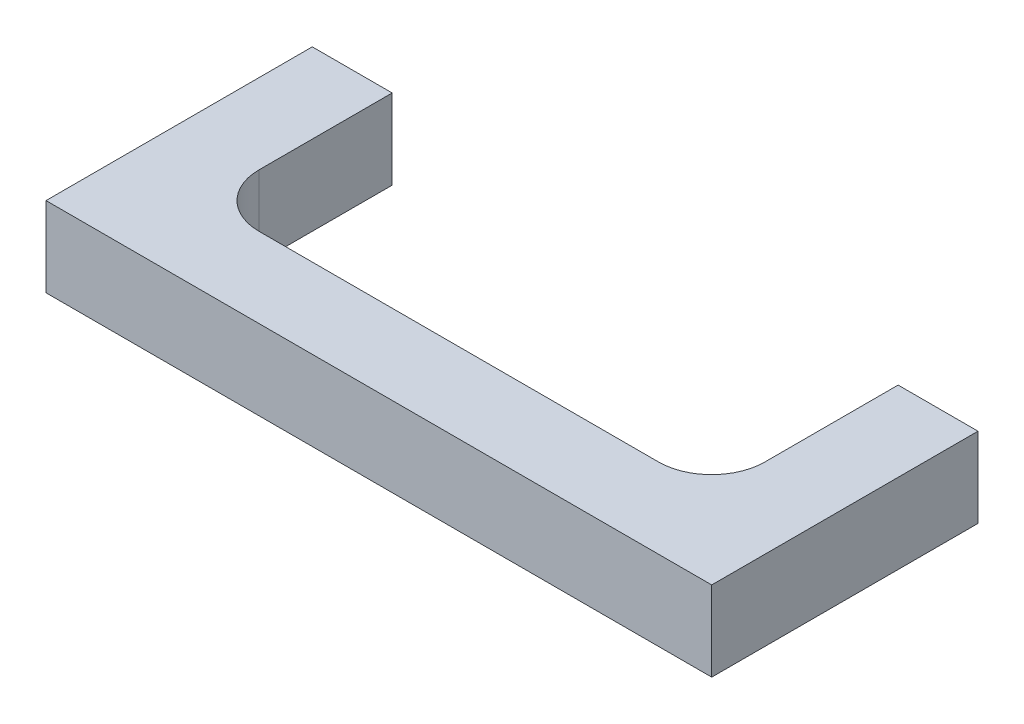
ISO-10303-21;
HEADER;
FILE_DESCRIPTION(('STEP AP214'),'2;1');
FILE_NAME('part.step','',(''),(''),'','','');
FILE_SCHEMA(('AUTOMOTIVE_DESIGN { 1 0 10303 214 1 1 1 1 }'));
ENDSEC;
DATA;
#1=APPLICATION_CONTEXT('core data for automotive mechanical design processes');
#2=APPLICATION_PROTOCOL_DEFINITION('international standard','automotive_design',2000,#1);
#3=PRODUCT_CONTEXT('',#1,'mechanical');
#4=PRODUCT('Part','Part','',(#3));
#5=PRODUCT_RELATED_PRODUCT_CATEGORY('part','',(#4));
#6=PRODUCT_DEFINITION_FORMATION('','',#4);
#7=PRODUCT_DEFINITION_CONTEXT('part definition',#1,'design');
#8=PRODUCT_DEFINITION('design','',#6,#7);
#9=PRODUCT_DEFINITION_SHAPE('','',#8);
#10=(LENGTH_UNIT() NAMED_UNIT(*) SI_UNIT(.MILLI.,.METRE.));
#11=(NAMED_UNIT(*) PLANE_ANGLE_UNIT() SI_UNIT($,.RADIAN.));
#12=(NAMED_UNIT(*) SI_UNIT($,.STERADIAN.) SOLID_ANGLE_UNIT());
#13=UNCERTAINTY_MEASURE_WITH_UNIT(LENGTH_MEASURE(1.E-05),#10,'distance_accuracy_value','');
#14=(GEOMETRIC_REPRESENTATION_CONTEXT(3) GLOBAL_UNCERTAINTY_ASSIGNED_CONTEXT((#13)) GLOBAL_UNIT_ASSIGNED_CONTEXT((#10,
#11,#12)) REPRESENTATION_CONTEXT('',''));
#15=CARTESIAN_POINT('',(0.,0.,0.));
#16=DIRECTION('',(0.,0.,1.));
#17=DIRECTION('',(1.,0.,0.));
#18=AXIS2_PLACEMENT_3D('',#15,#16,#17);
#19=CARTESIAN_POINT('',(-12.5,-3.,0.));
#20=DIRECTION('',(-1.,0.,0.));
#21=DIRECTION('',(0.,0.,1.));
#22=AXIS2_PLACEMENT_3D('',#19,#20,#21);
#23=PLANE('',#22);
#24=DIRECTION('',(0.,0.,1.));
#25=VECTOR('',#24,1.);
#26=CARTESIAN_POINT('',(-12.5,0.,0.));
#27=LINE('',#26,#25);
#28=CARTESIAN_POINT('',(-12.5,0.,-10.));
#29=VERTEX_POINT('',#28);
#30=CARTESIAN_POINT('',(-12.5,0.,0.));
#31=VERTEX_POINT('',#30);
#32=EDGE_CURVE('E151',#29,#31,#27,.T.);
#33=ORIENTED_EDGE('',*,*,#32,.F.);
#34=DIRECTION('',(0.,1.,0.));
#35=VECTOR('',#34,1.);
#36=CARTESIAN_POINT('',(-12.5,-3.,-10.));
#37=LINE('',#36,#35);
#38=CARTESIAN_POINT('',(-12.5,-3.,-10.));
#39=VERTEX_POINT('',#38);
#40=EDGE_CURVE('E132',#39,#29,#37,.T.);
#41=ORIENTED_EDGE('',*,*,#40,.F.);
#42=DIRECTION('',(0.,0.,1.));
#43=VECTOR('',#42,1.);
#44=CARTESIAN_POINT('',(-12.5,-3.,0.));
#45=LINE('',#44,#43);
#46=CARTESIAN_POINT('',(-12.5,-3.,0.));
#47=VERTEX_POINT('',#46);
#48=EDGE_CURVE('E126',#39,#47,#45,.T.);
#49=ORIENTED_EDGE('',*,*,#48,.T.);
#50=DIRECTION('',(0.,1.,0.));
#51=VECTOR('',#50,1.);
#52=CARTESIAN_POINT('',(-12.5,-3.,0.));
#53=LINE('',#52,#51);
#54=EDGE_CURVE('E108',#47,#31,#53,.T.);
#55=ORIENTED_EDGE('',*,*,#54,.T.);
#56=EDGE_LOOP('',(#33,#41,#49,#55));
#57=FACE_BOUND('',#56,.T.);
#58=ADVANCED_FACE('F33',(#57),#23,.T.);
#59=CARTESIAN_POINT('',(-12.5,-3.,-10.));
#60=DIRECTION('',(0.,0.,-1.));
#61=DIRECTION('',(-1.,0.,0.));
#62=AXIS2_PLACEMENT_3D('',#59,#60,#61);
#63=PLANE('',#62);
#64=DIRECTION('',(-1.,0.,0.));
#65=VECTOR('',#64,1.);
#66=CARTESIAN_POINT('',(-12.5,0.,-10.));
#67=LINE('',#66,#65);
#68=CARTESIAN_POINT('',(-9.5,0.,-10.));
#69=VERTEX_POINT('',#68);
#70=EDGE_CURVE('E133',#69,#29,#67,.T.);
#71=ORIENTED_EDGE('',*,*,#70,.F.);
#72=DIRECTION('',(0.,1.,0.));
#73=VECTOR('',#72,1.);
#74=CARTESIAN_POINT('',(-9.5,-3.,-10.));
#75=LINE('',#74,#73);
#76=CARTESIAN_POINT('',(-9.5,-3.,-10.));
#77=VERTEX_POINT('',#76);
#78=EDGE_CURVE('E167',#77,#69,#75,.T.);
#79=ORIENTED_EDGE('',*,*,#78,.F.);
#80=DIRECTION('',(-1.,0.,0.));
#81=VECTOR('',#80,1.);
#82=CARTESIAN_POINT('',(-12.5,-3.,-10.));
#83=LINE('',#82,#81);
#84=EDGE_CURVE('E119',#77,#39,#83,.T.);
#85=ORIENTED_EDGE('',*,*,#84,.T.);
#86=ORIENTED_EDGE('',*,*,#40,.T.);
#87=EDGE_LOOP('',(#71,#79,#85,#86));
#88=FACE_BOUND('',#87,.T.);
#89=ADVANCED_FACE('F206',(#88),#63,.T.);
#90=CARTESIAN_POINT('',(-9.5,-3.,-10.));
#91=DIRECTION('',(1.,0.,0.));
#92=DIRECTION('',(0.,0.,-1.));
#93=AXIS2_PLACEMENT_3D('',#90,#91,#92);
#94=PLANE('',#93);
#95=DIRECTION('',(0.,0.,-1.));
#96=VECTOR('',#95,1.);
#97=CARTESIAN_POINT('',(-9.5,0.,-10.));
#98=LINE('',#97,#96);
#99=CARTESIAN_POINT('',(-9.5,0.,-5.));
#100=VERTEX_POINT('',#99);
#101=EDGE_CURVE('E136',#100,#69,#98,.T.);
#102=ORIENTED_EDGE('',*,*,#101,.F.);
#103=DIRECTION('',(0.,1.,0.));
#104=VECTOR('',#103,1.);
#105=CARTESIAN_POINT('',(-9.5,-3.,-5.));
#106=LINE('',#105,#104);
#107=CARTESIAN_POINT('',(-9.5,-3.,-5.));
#108=VERTEX_POINT('',#107);
#109=EDGE_CURVE('E177',#100,#108,#106,.F.);
#110=ORIENTED_EDGE('',*,*,#109,.T.);
#111=DIRECTION('',(0.,0.,-1.));
#112=VECTOR('',#111,1.);
#113=CARTESIAN_POINT('',(-9.5,-3.,-10.));
#114=LINE('',#113,#112);
#115=EDGE_CURVE('E148',#108,#77,#114,.T.);
#116=ORIENTED_EDGE('',*,*,#115,.T.);
#117=ORIENTED_EDGE('',*,*,#78,.T.);
#118=EDGE_LOOP('',(#102,#110,#116,#117));
#119=FACE_BOUND('',#118,.T.);
#120=ADVANCED_FACE('F211',(#119),#94,.T.);
#121=CARTESIAN_POINT('',(-9.5,-3.,-3.));
#122=DIRECTION('',(0.,0.,-1.));
#123=DIRECTION('',(-1.,0.,0.));
#124=AXIS2_PLACEMENT_3D('',#121,#122,#123);
#125=PLANE('',#124);
#126=DIRECTION('',(-1.,0.,0.));
#127=VECTOR('',#126,1.);
#128=CARTESIAN_POINT('',(-9.5,0.,-3.));
#129=LINE('',#128,#127);
#130=CARTESIAN_POINT('',(7.5,0.,-3.));
#131=VERTEX_POINT('',#130);
#132=CARTESIAN_POINT('',(-7.5,0.,-3.));
#133=VERTEX_POINT('',#132);
#134=EDGE_CURVE('E162',#131,#133,#129,.T.);
#135=ORIENTED_EDGE('',*,*,#134,.F.);
#136=DIRECTION('',(0.,1.,0.));
#137=VECTOR('',#136,1.);
#138=CARTESIAN_POINT('',(7.5,-3.,-3.));
#139=LINE('',#138,#137);
#140=CARTESIAN_POINT('',(7.5,-3.,-3.));
#141=VERTEX_POINT('',#140);
#142=EDGE_CURVE('E54',#131,#141,#139,.F.);
#143=ORIENTED_EDGE('',*,*,#142,.T.);
#144=DIRECTION('',(-1.,0.,0.));
#145=VECTOR('',#144,1.);
#146=CARTESIAN_POINT('',(-9.5,-3.,-3.));
#147=LINE('',#146,#145);
#148=CARTESIAN_POINT('',(-7.5,-3.,-3.));
#149=VERTEX_POINT('',#148);
#150=EDGE_CURVE('E146',#141,#149,#147,.T.);
#151=ORIENTED_EDGE('',*,*,#150,.T.);
#152=DIRECTION('',(0.,1.,0.));
#153=VECTOR('',#152,1.);
#154=CARTESIAN_POINT('',(-7.5,0.,-3.));
#155=LINE('',#154,#153);
#156=EDGE_CURVE('E166',#149,#133,#155,.T.);
#157=ORIENTED_EDGE('',*,*,#156,.T.);
#158=EDGE_LOOP('',(#135,#143,#151,#157));
#159=FACE_BOUND('',#158,.T.);
#160=ADVANCED_FACE('F225',(#159),#125,.T.);
#161=CARTESIAN_POINT('',(9.5,-3.,-10.));
#162=DIRECTION('',(-1.,0.,0.));
#163=DIRECTION('',(0.,0.,1.));
#164=AXIS2_PLACEMENT_3D('',#161,#162,#163);
#165=PLANE('',#164);
#166=DIRECTION('',(0.,0.,1.));
#167=VECTOR('',#166,1.);
#168=CARTESIAN_POINT('',(9.5,-3.,-10.));
#169=LINE('',#168,#167);
#170=CARTESIAN_POINT('',(9.5,-3.,-10.));
#171=VERTEX_POINT('',#170);
#172=CARTESIAN_POINT('',(9.5,-3.,-5.));
#173=VERTEX_POINT('',#172);
#174=EDGE_CURVE('E143',#171,#173,#169,.T.);
#175=ORIENTED_EDGE('',*,*,#174,.T.);
#176=DIRECTION('',(0.,1.,0.));
#177=VECTOR('',#176,1.);
#178=CARTESIAN_POINT('',(9.5,0.,-5.));
#179=LINE('',#178,#177);
#180=CARTESIAN_POINT('',(9.5,0.,-5.));
#181=VERTEX_POINT('',#180);
#182=EDGE_CURVE('E184',#173,#181,#179,.T.);
#183=ORIENTED_EDGE('',*,*,#182,.T.);
#184=DIRECTION('',(0.,0.,1.));
#185=VECTOR('',#184,1.);
#186=CARTESIAN_POINT('',(9.5,0.,-10.));
#187=LINE('',#186,#185);
#188=CARTESIAN_POINT('',(9.5,0.,-10.));
#189=VERTEX_POINT('',#188);
#190=EDGE_CURVE('E160',#189,#181,#187,.T.);
#191=ORIENTED_EDGE('',*,*,#190,.F.);
#192=DIRECTION('',(0.,1.,0.));
#193=VECTOR('',#192,1.);
#194=CARTESIAN_POINT('',(9.5,-3.,-10.));
#195=LINE('',#194,#193);
#196=EDGE_CURVE('E170',#171,#189,#195,.T.);
#197=ORIENTED_EDGE('',*,*,#196,.F.);
#198=EDGE_LOOP('',(#175,#183,#191,#197));
#199=FACE_BOUND('',#198,.T.);
#200=ADVANCED_FACE('F190',(#199),#165,.T.);
#201=CARTESIAN_POINT('',(12.5,-3.,-10.));
#202=DIRECTION('',(0.,0.,-1.));
#203=DIRECTION('',(-1.,0.,0.));
#204=AXIS2_PLACEMENT_3D('',#201,#202,#203);
#205=PLANE('',#204);
#206=DIRECTION('',(-1.,0.,0.));
#207=VECTOR('',#206,1.);
#208=CARTESIAN_POINT('',(12.5,0.,-10.));
#209=LINE('',#208,#207);
#210=CARTESIAN_POINT('',(12.5,0.,-10.));
#211=VERTEX_POINT('',#210);
#212=EDGE_CURVE('E157',#211,#189,#209,.T.);
#213=ORIENTED_EDGE('',*,*,#212,.F.);
#214=DIRECTION('',(0.,1.,0.));
#215=VECTOR('',#214,1.);
#216=CARTESIAN_POINT('',(12.5,-3.,-10.));
#217=LINE('',#216,#215);
#218=CARTESIAN_POINT('',(12.5,-3.,-10.));
#219=VERTEX_POINT('',#218);
#220=EDGE_CURVE('E172',#219,#211,#217,.T.);
#221=ORIENTED_EDGE('',*,*,#220,.F.);
#222=DIRECTION('',(-1.,0.,0.));
#223=VECTOR('',#222,1.);
#224=CARTESIAN_POINT('',(12.5,-3.,-10.));
#225=LINE('',#224,#223);
#226=EDGE_CURVE('E140',#219,#171,#225,.T.);
#227=ORIENTED_EDGE('',*,*,#226,.T.);
#228=ORIENTED_EDGE('',*,*,#196,.T.);
#229=EDGE_LOOP('',(#213,#221,#227,#228));
#230=FACE_BOUND('',#229,.T.);
#231=ADVANCED_FACE('F198',(#230),#205,.T.);
#232=CARTESIAN_POINT('',(12.5,-3.,0.));
#233=DIRECTION('',(1.,0.,0.));
#234=DIRECTION('',(0.,0.,-1.));
#235=AXIS2_PLACEMENT_3D('',#232,#233,#234);
#236=PLANE('',#235);
#237=DIRECTION('',(0.,0.,-1.));
#238=VECTOR('',#237,1.);
#239=CARTESIAN_POINT('',(12.5,0.,0.));
#240=LINE('',#239,#238);
#241=CARTESIAN_POINT('',(12.5,0.,0.));
#242=VERTEX_POINT('',#241);
#243=EDGE_CURVE('E154',#242,#211,#240,.T.);
#244=ORIENTED_EDGE('',*,*,#243,.F.);
#245=DIRECTION('',(0.,1.,0.));
#246=VECTOR('',#245,1.);
#247=CARTESIAN_POINT('',(12.5,-3.,0.));
#248=LINE('',#247,#246);
#249=CARTESIAN_POINT('',(12.5,-3.,0.));
#250=VERTEX_POINT('',#249);
#251=EDGE_CURVE('E118',#250,#242,#248,.T.);
#252=ORIENTED_EDGE('',*,*,#251,.F.);
#253=DIRECTION('',(0.,0.,-1.));
#254=VECTOR('',#253,1.);
#255=CARTESIAN_POINT('',(12.5,-3.,0.));
#256=LINE('',#255,#254);
#257=EDGE_CURVE('E130',#250,#219,#256,.T.);
#258=ORIENTED_EDGE('',*,*,#257,.T.);
#259=ORIENTED_EDGE('',*,*,#220,.T.);
#260=EDGE_LOOP('',(#244,#252,#258,#259));
#261=FACE_BOUND('',#260,.T.);
#262=ADVANCED_FACE('F217',(#261),#236,.T.);
#263=CARTESIAN_POINT('',(12.5,-3.,0.));
#264=DIRECTION('',(0.,0.,1.));
#265=DIRECTION('',(1.,0.,0.));
#266=AXIS2_PLACEMENT_3D('',#263,#264,#265);
#267=PLANE('',#266);
#268=DIRECTION('',(1.,0.,0.));
#269=VECTOR('',#268,1.);
#270=CARTESIAN_POINT('',(12.5,0.,0.));
#271=LINE('',#270,#269);
#272=EDGE_CURVE('E113',#31,#242,#271,.T.);
#273=ORIENTED_EDGE('',*,*,#272,.F.);
#274=ORIENTED_EDGE('',*,*,#54,.F.);
#275=DIRECTION('',(1.,0.,0.));
#276=VECTOR('',#275,1.);
#277=CARTESIAN_POINT('',(12.5,-3.,0.));
#278=LINE('',#277,#276);
#279=EDGE_CURVE('E111',#47,#250,#278,.T.);
#280=ORIENTED_EDGE('',*,*,#279,.T.);
#281=ORIENTED_EDGE('',*,*,#251,.T.);
#282=EDGE_LOOP('',(#273,#274,#280,#281));
#283=FACE_BOUND('',#282,.T.);
#284=ADVANCED_FACE('F110',(#283),#267,.T.);
#285=CARTESIAN_POINT('',(0.,-3.,0.));
#286=DIRECTION('',(0.,-1.,0.));
#287=DIRECTION('',(0.,0.,-1.));
#288=AXIS2_PLACEMENT_3D('',#285,#286,#287);
#289=PLANE('',#288);
#290=ORIENTED_EDGE('',*,*,#48,.F.);
#291=ORIENTED_EDGE('',*,*,#84,.F.);
#292=ORIENTED_EDGE('',*,*,#115,.F.);
#293=CARTESIAN_POINT('',(-7.5,-3.,-5.));
#294=DIRECTION('',(0.,-1.,0.));
#295=DIRECTION('',(0.,0.,-1.));
#296=AXIS2_PLACEMENT_3D('',#293,#294,#295);
#297=CIRCLE('',#296,2.);
#298=EDGE_CURVE('E181',#108,#149,#297,.F.);
#299=ORIENTED_EDGE('',*,*,#298,.T.);
#300=ORIENTED_EDGE('',*,*,#150,.F.);
#301=CARTESIAN_POINT('',(7.5,-3.,-5.));
#302=DIRECTION('',(0.,-1.,0.));
#303=DIRECTION('',(0.,0.,-1.));
#304=AXIS2_PLACEMENT_3D('',#301,#302,#303);
#305=CIRCLE('',#304,2.);
#306=EDGE_CURVE('E11',#141,#173,#305,.F.);
#307=ORIENTED_EDGE('',*,*,#306,.T.);
#308=ORIENTED_EDGE('',*,*,#174,.F.);
#309=ORIENTED_EDGE('',*,*,#226,.F.);
#310=ORIENTED_EDGE('',*,*,#257,.F.);
#311=ORIENTED_EDGE('',*,*,#279,.F.);
#312=EDGE_LOOP('',(#290,#291,#292,#299,#300,#307,#308,#309,#310,#311));
#313=FACE_BOUND('',#312,.T.);
#314=ADVANCED_FACE('F124',(#313),#289,.T.);
#315=CARTESIAN_POINT('',(0.,0.,0.));
#316=DIRECTION('',(0.,-1.,0.));
#317=DIRECTION('',(0.,0.,-1.));
#318=AXIS2_PLACEMENT_3D('',#315,#316,#317);
#319=PLANE('',#318);
#320=ORIENTED_EDGE('',*,*,#32,.T.);
#321=ORIENTED_EDGE('',*,*,#272,.T.);
#322=ORIENTED_EDGE('',*,*,#243,.T.);
#323=ORIENTED_EDGE('',*,*,#212,.T.);
#324=ORIENTED_EDGE('',*,*,#190,.T.);
#325=CARTESIAN_POINT('',(7.5,0.,-5.));
#326=DIRECTION('',(0.,-1.,0.));
#327=DIRECTION('',(0.,0.,-1.));
#328=AXIS2_PLACEMENT_3D('',#325,#326,#327);
#329=CIRCLE('',#328,2.);
#330=EDGE_CURVE('E41',#181,#131,#329,.T.);
#331=ORIENTED_EDGE('',*,*,#330,.T.);
#332=ORIENTED_EDGE('',*,*,#134,.T.);
#333=CARTESIAN_POINT('',(-7.5,0.,-5.));
#334=DIRECTION('',(0.,-1.,0.));
#335=DIRECTION('',(0.,0.,-1.));
#336=AXIS2_PLACEMENT_3D('',#333,#334,#335);
#337=CIRCLE('',#336,2.);
#338=EDGE_CURVE('E179',#133,#100,#337,.T.);
#339=ORIENTED_EDGE('',*,*,#338,.T.);
#340=ORIENTED_EDGE('',*,*,#101,.T.);
#341=ORIENTED_EDGE('',*,*,#70,.T.);
#342=EDGE_LOOP('',(#320,#321,#322,#323,#324,#331,#332,#339,#340,#341));
#343=FACE_BOUND('',#342,.T.);
#344=ADVANCED_FACE('F194',(#343),#319,.F.);
#345=CARTESIAN_POINT('',(-7.5,-3.,-5.));
#346=DIRECTION('',(0.,-1.,0.));
#347=DIRECTION('',(0.,0.,-1.));
#348=AXIS2_PLACEMENT_3D('',#345,#346,#347);
#349=CYLINDRICAL_SURFACE('',#348,2.);
#350=ORIENTED_EDGE('',*,*,#298,.F.);
#351=ORIENTED_EDGE('',*,*,#109,.F.);
#352=ORIENTED_EDGE('',*,*,#338,.F.);
#353=ORIENTED_EDGE('',*,*,#156,.F.);
#354=EDGE_LOOP('',(#350,#351,#352,#353));
#355=FACE_BOUND('',#354,.T.);
#356=ADVANCED_FACE('F200',(#355),#349,.F.);
#357=CARTESIAN_POINT('',(7.5,-3.,-5.));
#358=DIRECTION('',(0.,-1.,0.));
#359=DIRECTION('',(0.,0.,-1.));
#360=AXIS2_PLACEMENT_3D('',#357,#358,#359);
#361=CYLINDRICAL_SURFACE('',#360,2.);
#362=ORIENTED_EDGE('',*,*,#306,.F.);
#363=ORIENTED_EDGE('',*,*,#142,.F.);
#364=ORIENTED_EDGE('',*,*,#330,.F.);
#365=ORIENTED_EDGE('',*,*,#182,.F.);
#366=EDGE_LOOP('',(#362,#363,#364,#365));
#367=FACE_BOUND('',#366,.T.);
#368=ADVANCED_FACE('F35',(#367),#361,.F.);
#369=CLOSED_SHELL('',(#58,#89,#120,#160,#200,#231,#262,#284,#314,#344,#356,#368));
#370=MANIFOLD_SOLID_BREP('B2',#369);
#371=ADVANCED_BREP_SHAPE_REPRESENTATION('',(#18,#370),#14);
#372=SHAPE_DEFINITION_REPRESENTATION(#9,#371);
ENDSEC;
END-ISO-10303-21;
